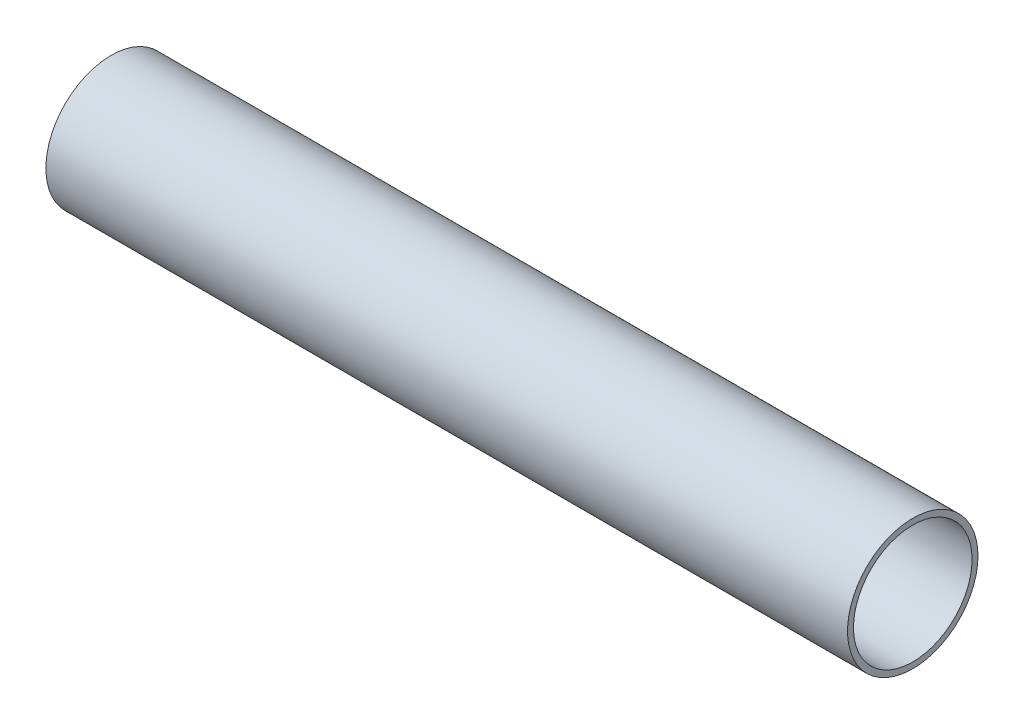
ISO-10303-21;
HEADER;
FILE_DESCRIPTION(('STEP AP214'),'2;1');
FILE_NAME('part.step','',(''),(''),'','','');
FILE_SCHEMA(('AUTOMOTIVE_DESIGN { 1 0 10303 214 1 1 1 1 }'));
ENDSEC;
DATA;
#1=APPLICATION_CONTEXT('core data for automotive mechanical design processes');
#2=APPLICATION_PROTOCOL_DEFINITION('international standard','automotive_design',2000,#1);
#3=PRODUCT_CONTEXT('',#1,'mechanical');
#4=PRODUCT('Part','Part','',(#3));
#5=PRODUCT_RELATED_PRODUCT_CATEGORY('part','',(#4));
#6=PRODUCT_DEFINITION_FORMATION('','',#4);
#7=PRODUCT_DEFINITION_CONTEXT('part definition',#1,'design');
#8=PRODUCT_DEFINITION('design','',#6,#7);
#9=PRODUCT_DEFINITION_SHAPE('','',#8);
#10=(LENGTH_UNIT() NAMED_UNIT(*) SI_UNIT(.MILLI.,.METRE.));
#11=(NAMED_UNIT(*) PLANE_ANGLE_UNIT() SI_UNIT($,.RADIAN.));
#12=(NAMED_UNIT(*) SI_UNIT($,.STERADIAN.) SOLID_ANGLE_UNIT());
#13=UNCERTAINTY_MEASURE_WITH_UNIT(LENGTH_MEASURE(1.E-05),#10,'distance_accuracy_value','');
#14=(GEOMETRIC_REPRESENTATION_CONTEXT(3) GLOBAL_UNCERTAINTY_ASSIGNED_CONTEXT((#13)) GLOBAL_UNIT_ASSIGNED_CONTEXT((#10,
#11,#12)) REPRESENTATION_CONTEXT('',''));
#15=CARTESIAN_POINT('',(0.,0.,0.));
#16=DIRECTION('',(0.,0.,1.));
#17=DIRECTION('',(1.,0.,0.));
#18=AXIS2_PLACEMENT_3D('',#15,#16,#17);
#19=CARTESIAN_POINT('',(-338.,0.,0.));
#20=DIRECTION('',(1.,0.,0.));
#21=DIRECTION('',(0.,0.,-1.));
#22=AXIS2_PLACEMENT_3D('',#19,#20,#21);
#23=CYLINDRICAL_SURFACE('',#22,27.5);
#24=CARTESIAN_POINT('',(-338.,0.,0.));
#25=DIRECTION('',(1.,0.,0.));
#26=DIRECTION('',(0.,0.,-1.));
#27=AXIS2_PLACEMENT_3D('',#24,#25,#26);
#28=CIRCLE('',#27,27.5);
#29=CARTESIAN_POINT('',(-338.,0.,-27.5));
#30=VERTEX_POINT('',#29);
#31=EDGE_CURVE('E10',#30,#30,#28,.T.);
#32=ORIENTED_EDGE('',*,*,#31,.T.);
#33=EDGE_LOOP('',(#32));
#34=FACE_BOUND('',#33,.T.);
#35=CARTESIAN_POINT('',(0.,0.,0.));
#36=DIRECTION('',(1.,0.,0.));
#37=DIRECTION('',(0.,0.,-1.));
#38=AXIS2_PLACEMENT_3D('',#35,#36,#37);
#39=CIRCLE('',#38,27.5);
#40=CARTESIAN_POINT('',(0.,0.,-27.5));
#41=VERTEX_POINT('',#40);
#42=EDGE_CURVE('E40',#41,#41,#39,.T.);
#43=ORIENTED_EDGE('',*,*,#42,.F.);
#44=EDGE_LOOP('',(#43));
#45=FACE_BOUND('',#44,.T.);
#46=ADVANCED_FACE('F37',(#34,#45),#23,.T.);
#47=CARTESIAN_POINT('',(-338.,0.,0.));
#48=DIRECTION('',(1.,0.,0.));
#49=DIRECTION('',(0.,0.,-1.));
#50=AXIS2_PLACEMENT_3D('',#47,#48,#49);
#51=PLANE('',#50);
#52=CARTESIAN_POINT('',(-338.,0.,0.));
#53=DIRECTION('',(1.,0.,0.));
#54=DIRECTION('',(0.,0.,-1.));
#55=AXIS2_PLACEMENT_3D('',#52,#53,#54);
#56=CIRCLE('',#55,25.);
#57=CARTESIAN_POINT('',(-338.,0.,-25.));
#58=VERTEX_POINT('',#57);
#59=EDGE_CURVE('E47',#58,#58,#56,.T.);
#60=ORIENTED_EDGE('',*,*,#59,.T.);
#61=EDGE_LOOP('',(#60));
#62=FACE_BOUND('',#61,.T.);
#63=ORIENTED_EDGE('',*,*,#31,.F.);
#64=EDGE_LOOP('',(#63));
#65=FACE_BOUND('',#64,.T.);
#66=ADVANCED_FACE('F55',(#62,#65),#51,.F.);
#67=CARTESIAN_POINT('',(0.,0.,0.));
#68=DIRECTION('',(1.,0.,0.));
#69=DIRECTION('',(0.,0.,-1.));
#70=AXIS2_PLACEMENT_3D('',#67,#68,#69);
#71=PLANE('',#70);
#72=CARTESIAN_POINT('',(0.,0.,0.));
#73=DIRECTION('',(1.,0.,0.));
#74=DIRECTION('',(0.,0.,-1.));
#75=AXIS2_PLACEMENT_3D('',#72,#73,#74);
#76=CIRCLE('',#75,25.);
#77=CARTESIAN_POINT('',(0.,0.,-25.));
#78=VERTEX_POINT('',#77);
#79=EDGE_CURVE('E49',#78,#78,#76,.T.);
#80=ORIENTED_EDGE('',*,*,#79,.F.);
#81=EDGE_LOOP('',(#80));
#82=FACE_BOUND('',#81,.T.);
#83=ORIENTED_EDGE('',*,*,#42,.T.);
#84=EDGE_LOOP('',(#83));
#85=FACE_BOUND('',#84,.T.);
#86=ADVANCED_FACE('F61',(#82,#85),#71,.T.);
#87=CARTESIAN_POINT('',(-338.,0.,0.));
#88=DIRECTION('',(1.,0.,0.));
#89=DIRECTION('',(0.,0.,-1.));
#90=AXIS2_PLACEMENT_3D('',#87,#88,#89);
#91=CYLINDRICAL_SURFACE('',#90,25.);
#92=ORIENTED_EDGE('',*,*,#59,.F.);
#93=EDGE_LOOP('',(#92));
#94=FACE_BOUND('',#93,.T.);
#95=ORIENTED_EDGE('',*,*,#79,.T.);
#96=EDGE_LOOP('',(#95));
#97=FACE_BOUND('',#96,.T.);
#98=ADVANCED_FACE('F58',(#94,#97),#91,.F.);
#99=CLOSED_SHELL('',(#46,#66,#86,#98));
#100=MANIFOLD_SOLID_BREP('B2',#99);
#101=ADVANCED_BREP_SHAPE_REPRESENTATION('',(#18,#100),#14);
#102=SHAPE_DEFINITION_REPRESENTATION(#9,#101);
ENDSEC;
END-ISO-10303-21;
